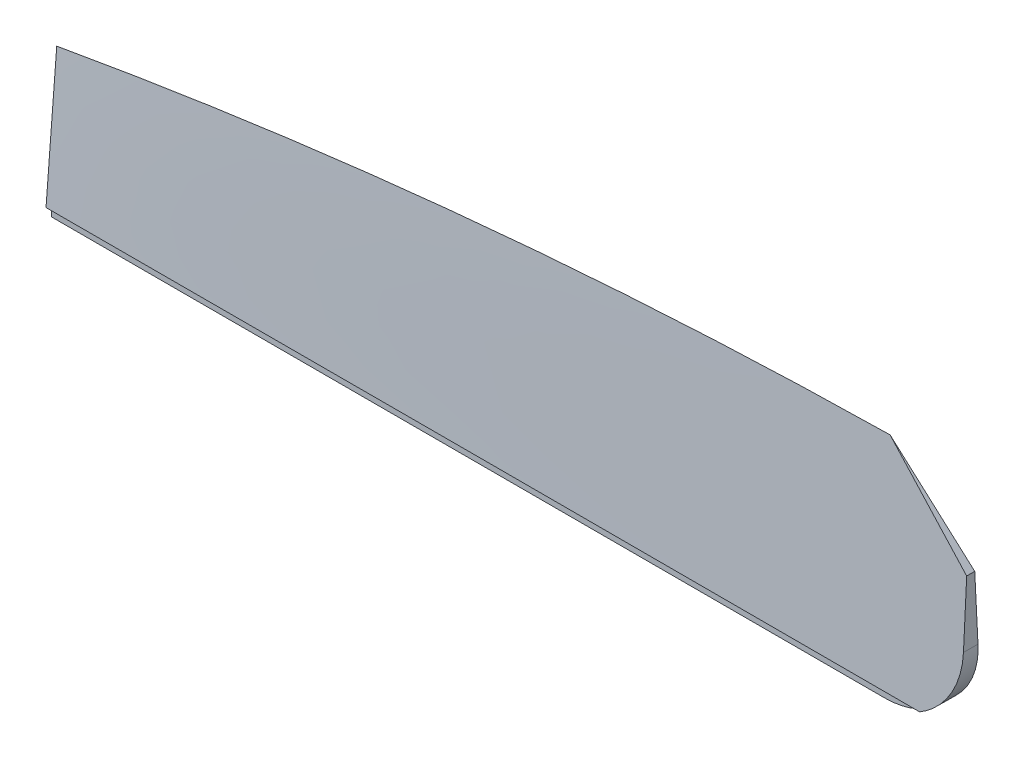
ISO-10303-21;
HEADER;
FILE_DESCRIPTION(('STEP AP214'),'2;1');
FILE_NAME('part.step','',(''),(''),'','','');
FILE_SCHEMA(('AUTOMOTIVE_DESIGN { 1 0 10303 214 1 1 1 1 }'));
ENDSEC;
DATA;
#1=APPLICATION_CONTEXT('core data for automotive mechanical design processes');
#2=APPLICATION_PROTOCOL_DEFINITION('international standard','automotive_design',2000,#1);
#3=PRODUCT_CONTEXT('',#1,'mechanical');
#4=PRODUCT('Part','Part','',(#3));
#5=PRODUCT_RELATED_PRODUCT_CATEGORY('part','',(#4));
#6=PRODUCT_DEFINITION_FORMATION('','',#4);
#7=PRODUCT_DEFINITION_CONTEXT('part definition',#1,'design');
#8=PRODUCT_DEFINITION('design','',#6,#7);
#9=PRODUCT_DEFINITION_SHAPE('','',#8);
#10=(LENGTH_UNIT() NAMED_UNIT(*) SI_UNIT(.MILLI.,.METRE.));
#11=(NAMED_UNIT(*) PLANE_ANGLE_UNIT() SI_UNIT($,.RADIAN.));
#12=(NAMED_UNIT(*) SI_UNIT($,.STERADIAN.) SOLID_ANGLE_UNIT());
#13=UNCERTAINTY_MEASURE_WITH_UNIT(LENGTH_MEASURE(1.E-05),#10,'distance_accuracy_value','');
#14=(GEOMETRIC_REPRESENTATION_CONTEXT(3) GLOBAL_UNCERTAINTY_ASSIGNED_CONTEXT((#13)) GLOBAL_UNIT_ASSIGNED_CONTEXT((#10,
#11,#12)) REPRESENTATION_CONTEXT('',''));
#15=CARTESIAN_POINT('',(0.,0.,0.));
#16=DIRECTION('',(0.,0.,1.));
#17=DIRECTION('',(1.,0.,0.));
#18=AXIS2_PLACEMENT_3D('',#15,#16,#17);
#19=CARTESIAN_POINT('',(-878.284271247463,-49.9999999999999,-10.));
#20=DIRECTION('',(0.,0.,-1.));
#21=DIRECTION('',(0.,1.,0.));
#22=AXIS2_PLACEMENT_3D('',#19,#20,#21);
#23=PLANE('',#22);
#24=CARTESIAN_POINT('',(700.000000000002,80.0000000000001,-10.0000000000001));
#25=DIRECTION('',(0.,0.,-1.));
#26=DIRECTION('',(0.,1.,0.));
#27=AXIS2_PLACEMENT_3D('',#24,#25,#26);
#28=CIRCLE('',#27,150.);
#29=CARTESIAN_POINT('',(700.000000000002,-70.,-10.));
#30=VERTEX_POINT('',#29);
#31=CARTESIAN_POINT('',(774.833147735481,-49.9999999999999,-10.));
#32=VERTEX_POINT('',#31);
#33=EDGE_CURVE('E113',#30,#32,#28,.F.);
#34=ORIENTED_EDGE('',*,*,#33,.F.);
#35=DIRECTION('',(1.,0.,0.));
#36=VECTOR('',#35,1.);
#37=CARTESIAN_POINT('',(-878.284271247463,-69.9999999999999,-10.));
#38=LINE('',#37,#36);
#39=CARTESIAN_POINT('',(-850.000000000001,-69.9999999999999,-10.));
#40=VERTEX_POINT('',#39);
#41=EDGE_CURVE('E150',#40,#30,#38,.T.);
#42=ORIENTED_EDGE('',*,*,#41,.F.);
#43=DIRECTION('',(0.,-1.,0.));
#44=VECTOR('',#43,1.);
#45=CARTESIAN_POINT('',(-850.000000000001,-49.9999999999999,-10.));
#46=LINE('',#45,#44);
#47=CARTESIAN_POINT('',(-850.000000000001,-49.9999999999999,-10.));
#48=VERTEX_POINT('',#47);
#49=EDGE_CURVE('E162',#48,#40,#46,.T.);
#50=ORIENTED_EDGE('',*,*,#49,.F.);
#51=DIRECTION('',(1.,0.,0.));
#52=VECTOR('',#51,1.);
#53=CARTESIAN_POINT('',(-878.284271247463,-49.9999999999999,-10.));
#54=LINE('',#53,#52);
#55=EDGE_CURVE('E152',#48,#32,#54,.T.);
#56=ORIENTED_EDGE('',*,*,#55,.T.);
#57=EDGE_LOOP('',(#34,#42,#50,#56));
#58=FACE_BOUND('',#57,.T.);
#59=ADVANCED_FACE('F100',(#58),#23,.T.);
#60=CARTESIAN_POINT('',(-878.284271247463,-69.9999999999999,9.99999999999996));
#61=DIRECTION('',(0.,-1.,0.));
#62=DIRECTION('',(0.,0.,-1.));
#63=AXIS2_PLACEMENT_3D('',#60,#61,#62);
#64=PLANE('',#63);
#65=DIRECTION('',(0.,0.,1.));
#66=VECTOR('',#65,1.);
#67=CARTESIAN_POINT('',(700.000000000002,-70.,-20.0001));
#68=LINE('',#67,#66);
#69=CARTESIAN_POINT('',(700.000000000002,-70.,9.99999999999996));
#70=VERTEX_POINT('',#69);
#71=EDGE_CURVE('E137',#30,#70,#68,.T.);
#72=ORIENTED_EDGE('',*,*,#71,.T.);
#73=DIRECTION('',(1.,0.,0.));
#74=VECTOR('',#73,1.);
#75=CARTESIAN_POINT('',(-878.284271247463,-69.9999999999999,9.99999999999996));
#76=LINE('',#75,#74);
#77=CARTESIAN_POINT('',(-850.000000000001,-69.9999999999999,9.99999999999996));
#78=VERTEX_POINT('',#77);
#79=EDGE_CURVE('E156',#78,#70,#76,.T.);
#80=ORIENTED_EDGE('',*,*,#79,.F.);
#81=DIRECTION('',(0.,0.,1.));
#82=VECTOR('',#81,1.);
#83=CARTESIAN_POINT('',(-850.000000000001,-69.9999999999999,9.99999999999996));
#84=LINE('',#83,#82);
#85=EDGE_CURVE('E122',#40,#78,#84,.T.);
#86=ORIENTED_EDGE('',*,*,#85,.F.);
#87=ORIENTED_EDGE('',*,*,#41,.T.);
#88=EDGE_LOOP('',(#72,#80,#86,#87));
#89=FACE_BOUND('',#88,.T.);
#90=ADVANCED_FACE('F154',(#89),#64,.T.);
#91=CARTESIAN_POINT('',(-878.284271247463,-49.9999999999999,9.99999999999996));
#92=DIRECTION('',(0.,0.,1.));
#93=DIRECTION('',(0.,-1.,0.));
#94=AXIS2_PLACEMENT_3D('',#91,#92,#93);
#95=PLANE('',#94);
#96=CARTESIAN_POINT('',(700.000000000002,80.0000000000001,9.99999999999994));
#97=DIRECTION('',(0.,0.,1.));
#98=DIRECTION('',(0.,-1.,0.));
#99=AXIS2_PLACEMENT_3D('',#96,#97,#98);
#100=CIRCLE('',#99,150.);
#101=CARTESIAN_POINT('',(774.833147735481,-49.9999999999999,9.99999999999995));
#102=VERTEX_POINT('',#101);
#103=EDGE_CURVE('E140',#102,#70,#100,.F.);
#104=ORIENTED_EDGE('',*,*,#103,.F.);
#105=DIRECTION('',(1.,0.,0.));
#106=VECTOR('',#105,1.);
#107=CARTESIAN_POINT('',(-878.284271247463,-49.9999999999999,9.99999999999996));
#108=LINE('',#107,#106);
#109=CARTESIAN_POINT('',(-850.000000000001,-49.9999999999999,9.99999999999996));
#110=VERTEX_POINT('',#109);
#111=EDGE_CURVE('E159',#110,#102,#108,.T.);
#112=ORIENTED_EDGE('',*,*,#111,.F.);
#113=DIRECTION('',(0.,1.,0.));
#114=VECTOR('',#113,1.);
#115=CARTESIAN_POINT('',(-850.000000000001,-49.9999999999999,9.99999999999996));
#116=LINE('',#115,#114);
#117=EDGE_CURVE('E155',#78,#110,#116,.T.);
#118=ORIENTED_EDGE('',*,*,#117,.F.);
#119=ORIENTED_EDGE('',*,*,#79,.T.);
#120=EDGE_LOOP('',(#104,#112,#118,#119));
#121=FACE_BOUND('',#120,.T.);
#122=ADVANCED_FACE('F174',(#121),#95,.T.);
#123=CARTESIAN_POINT('',(-878.284271247463,-49.9999999999999,9.99999999999996));
#124=DIRECTION('',(0.,1.,0.));
#125=DIRECTION('',(0.,0.,1.));
#126=AXIS2_PLACEMENT_3D('',#123,#124,#125);
#127=PLANE('',#126);
#128=DIRECTION('',(0.,0.,1.));
#129=VECTOR('',#128,1.);
#130=CARTESIAN_POINT('',(774.833147735481,-49.9999999999999,-20.0001));
#131=LINE('',#130,#129);
#132=EDGE_CURVE('E14',#32,#102,#131,.T.);
#133=ORIENTED_EDGE('',*,*,#132,.F.);
#134=ORIENTED_EDGE('',*,*,#55,.F.);
#135=DIRECTION('',(0.,0.,-1.));
#136=VECTOR('',#135,1.);
#137=CARTESIAN_POINT('',(-850.000000000001,-49.9999999999999,9.99999999999996));
#138=LINE('',#137,#136);
#139=EDGE_CURVE('E107',#110,#48,#138,.T.);
#140=ORIENTED_EDGE('',*,*,#139,.F.);
#141=ORIENTED_EDGE('',*,*,#111,.T.);
#142=EDGE_LOOP('',(#133,#134,#140,#141));
#143=FACE_BOUND('',#142,.T.);
#144=ADVANCED_FACE('F171',(#143),#127,.T.);
#145=CARTESIAN_POINT('',(-850.000000000001,0.,0.));
#146=DIRECTION('',(1.,0.,0.));
#147=DIRECTION('',(0.,0.,-1.));
#148=AXIS2_PLACEMENT_3D('',#145,#146,#147);
#149=PLANE('',#148);
#150=ORIENTED_EDGE('',*,*,#49,.T.);
#151=ORIENTED_EDGE('',*,*,#85,.T.);
#152=ORIENTED_EDGE('',*,*,#117,.T.);
#153=ORIENTED_EDGE('',*,*,#139,.T.);
#154=EDGE_LOOP('',(#150,#151,#152,#153));
#155=FACE_BOUND('',#154,.T.);
#156=ADVANCED_FACE('F169',(#155),#149,.F.);
#157=CARTESIAN_POINT('',(700.000000000002,80.0000000000001,-20.0001));
#158=DIRECTION('',(0.,0.,1.));
#159=DIRECTION('',(1.,0.,0.));
#160=AXIS2_PLACEMENT_3D('',#157,#158,#159);
#161=CYLINDRICAL_SURFACE('',#160,150.);
#162=ORIENTED_EDGE('',*,*,#33,.T.);
#163=ORIENTED_EDGE('',*,*,#132,.T.);
#164=ORIENTED_EDGE('',*,*,#103,.T.);
#165=ORIENTED_EDGE('',*,*,#71,.F.);
#166=EDGE_LOOP('',(#162,#163,#164,#165));
#167=FACE_BOUND('',#166,.T.);
#168=ADVANCED_FACE('F138',(#167),#161,.T.);
#169=CLOSED_SHELL('',(#59,#90,#122,#144,#156,#168));
#170=MANIFOLD_SOLID_BREP('B2',#169);
#171=CARTESIAN_POINT('',(850.000000000002,0.,0.));
#172=DIRECTION('',(1.,0.,0.));
#173=DIRECTION('',(0.,0.,-1.));
#174=AXIS2_PLACEMENT_3D('',#171,#172,#173);
#175=PLANE('',#174);
#176=DIRECTION('',(0.,-0.998752338877845,0.0499376169438921));
#177=VECTOR('',#176,1.);
#178=CARTESIAN_POINT('',(850.000000000002,-49.9999999999999,20.));
#179=LINE('',#178,#177);
#180=CARTESIAN_POINT('',(850.000000000001,200.187149168324,7.49064254158379));
#181=VERTEX_POINT('',#180);
#182=CARTESIAN_POINT('',(850.000000000002,80.0000000000001,13.5));
#183=VERTEX_POINT('',#182);
#184=EDGE_CURVE('E227',#181,#183,#179,.T.);
#185=ORIENTED_EDGE('',*,*,#184,.T.);
#186=DIRECTION('',(0.,0.,1.));
#187=VECTOR('',#186,1.);
#188=CARTESIAN_POINT('',(850.000000000002,80.0000000000001,-20.0001));
#189=LINE('',#188,#187);
#190=CARTESIAN_POINT('',(850.000000000002,80.0000000000001,-13.5));
#191=VERTEX_POINT('',#190);
#192=EDGE_CURVE('E281',#191,#183,#189,.T.);
#193=ORIENTED_EDGE('',*,*,#192,.F.);
#194=DIRECTION('',(0.,0.998752338877845,0.0499376169438923));
#195=VECTOR('',#194,1.);
#196=CARTESIAN_POINT('',(850.000000000002,350.,0.));
#197=LINE('',#196,#195);
#198=CARTESIAN_POINT('',(850.000000000002,200.187149168324,-7.49064254158384));
#199=VERTEX_POINT('',#198);
#200=EDGE_CURVE('E248',#191,#199,#197,.T.);
#201=ORIENTED_EDGE('',*,*,#200,.T.);
#202=DIRECTION('',(0.,0.,1.));
#203=VECTOR('',#202,1.);
#204=CARTESIAN_POINT('',(850.000000000002,200.187149168324,0.));
#205=LINE('',#204,#203);
#206=EDGE_CURVE('E373',#199,#181,#205,.T.);
#207=ORIENTED_EDGE('',*,*,#206,.T.);
#208=EDGE_LOOP('',(#185,#193,#201,#207));
#209=FACE_BOUND('',#208,.T.);
#210=ADVANCED_FACE('F223',(#209),#175,.T.);
#211=CARTESIAN_POINT('',(850.000000000002,350.,0.));
#212=CARTESIAN_POINT('',(280.00816518473,350.,0.));
#213=CARTESIAN_POINT('',(-288.814905980155,299.809729014863,0.));
#214=CARTESIAN_POINT('',(-850.000000000001,200.,0.));
#215=CARTESIAN_POINT('',(850.000000000002,316.666666666667,-1.66666666666667));
#216=CARTESIAN_POINT('',(280.00816518473,320.833333333333,-1.66666666666667));
#217=CARTESIAN_POINT('',(-288.814905980155,274.809729014863,-1.66666666666667));
#218=CARTESIAN_POINT('',(-850.000000000001,179.166666666666,-1.66666666666667));
#219=CARTESIAN_POINT('',(850.000000000002,250.,-5.));
#220=CARTESIAN_POINT('',(280.374876172218,256.985827917574,-5.));
#221=CARTESIAN_POINT('',(-288.210379283017,219.316540671524,-5.));
#222=CARTESIAN_POINT('',(-850.000000000002,137.5,-5.));
#223=CARTESIAN_POINT('',(850.000000000002,150.,-10.));
#224=CARTESIAN_POINT('',(281.508403135182,152.441171642956,-10.));
#225=CARTESIAN_POINT('',(-286.34174885083,127.336746467719,-10.));
#226=CARTESIAN_POINT('',(-850.000000000002,75.0000000000001,-10.));
#227=CARTESIAN_POINT('',(850.000000000002,50.0000000000001,-15.));
#228=CARTESIAN_POINT('',(282.708718099148,46.892235313654,-15.));
#229=CARTESIAN_POINT('',(-284.363017737093,34.3564939163386,-15.));
#230=CARTESIAN_POINT('',(-850.000000000002,12.4999999999999,-15.));
#231=CARTESIAN_POINT('',(850.000000000002,-16.6666666666665,-18.3333333333334));
#232=CARTESIAN_POINT('',(283.209005088639,-18.963830211471,-18.3333333333334));
#233=CARTESIAN_POINT('',(-283.538289676856,-23.1376111221519,-18.3333333333334));
#234=CARTESIAN_POINT('',(-850.000000000001,-29.1666666666666,-18.3333333333334));
#235=CARTESIAN_POINT('',(850.000000000002,-49.9999999999999,-20.));
#236=CARTESIAN_POINT('',(283.298055756641,-49.4695369510483,-20.));
#237=CARTESIAN_POINT('',(-283.391488768123,-49.4715555855864,-20.));
#238=CARTESIAN_POINT('',(-850.000000000001,-49.9999999999999,-20.));
#239=B_SPLINE_SURFACE_WITH_KNOTS('',3,3,((#211,#212,#213,#214),(#215,#216,#217,#218),(#219,#220,
#221,#222),(#223,#224,#225,#226),(#227,#228,#229,#230),(#231,#232,#233,#234),(#235,#236,#237,
#238)),.UNSPECIFIED.,.F.,.F.,.F.,(4,1,1,1,4),(4,4),(0.,0.117411371706765,0.234822743413531,
0.352234115120296,0.469645486827062),(0.,1.),.UNSPECIFIED.);
#240=CARTESIAN_POINT('',(774.949660102837,-49.932861318719,-20.));
#241=CARTESIAN_POINT('',(776.77858711772,-48.8779075175034,-19.9465608704581));
#242=CARTESIAN_POINT('',(778.585167772061,-47.784315123692,-19.8912312247742));
#243=CARTESIAN_POINT('',(782.150398667031,-45.5219771033586,-19.7769006549077));
#244=CARTESIAN_POINT('',(783.909051282835,-44.3532352107069,-19.7178999131315));
#245=CARTESIAN_POINT('',(787.375321059771,-41.9426514605261,-19.596333316115));
#246=CARTESIAN_POINT('',(789.082939679335,-40.700811694982,-19.5337675629031));
#247=CARTESIAN_POINT('',(792.444146996505,-38.1462456513558,-19.4051819741731));
#248=CARTESIAN_POINT('',(794.097736161442,-36.8335199866671,-19.3391621685438));
#249=CARTESIAN_POINT('',(797.344943290174,-34.1420209252222,-19.2039092877608));
#250=CARTESIAN_POINT('',(798.938666816147,-32.7633745715606,-19.1346824007601));
#251=CARTESIAN_POINT('',(802.066537267821,-29.9402579340014,-18.9930217124556));
#252=CARTESIAN_POINT('',(803.60068463029,-28.4957881328392,-18.9205879346707));
#253=CARTESIAN_POINT('',(806.606694746188,-25.543595289172,-18.7726362925268));
#254=CARTESIAN_POINT('',(808.078557745969,-24.0358724968968,-18.6971184403685));
#255=CARTESIAN_POINT('',(810.95740122845,-20.9598559370413,-18.5431254986109));
#256=CARTESIAN_POINT('',(812.364381803895,-19.3915622560478,-18.4646504132389));
#257=CARTESIAN_POINT('',(815.112035929349,-16.1959613181554,-18.3048123472268));
#258=CARTESIAN_POINT('',(816.452657508962,-14.5686094846967,-18.2234471862111));
#259=CARTESIAN_POINT('',(819.064073766274,-11.2589161659202,-18.0580208447582));
#260=CARTESIAN_POINT('',(820.334867667326,-9.57657406931391,-17.973959634351));
#261=CARTESIAN_POINT('',(822.804365575482,-6.15991405452798,-17.8032818725874));
#262=CARTESIAN_POINT('',(824.003069625522,-4.42559616730517,-17.716665322753));
#263=CARTESIAN_POINT('',(826.326255849931,-0.908093100816467,-17.5410220620969));
#264=CARTESIAN_POINT('',(827.450738995349,0.875091438684212,-17.4519953828289));
#265=CARTESIAN_POINT('',(829.62378046871,4.48761861289257,-17.2716572170923));
#266=CARTESIAN_POINT('',(830.67232019397,6.31697240998206,-17.1803451781355));
#267=CARTESIAN_POINT('',(832.691324376901,10.018172046465,-16.9956098419942));
#268=CARTESIAN_POINT('',(833.661788632527,11.8900179958048,-16.9021865393469));
#269=CARTESIAN_POINT('',(835.522948971886,15.6729137761091,-16.713384068965));
#270=CARTESIAN_POINT('',(836.413642979662,17.5839646257596,-16.6180048504087));
#271=CARTESIAN_POINT('',(838.113712329987,21.4419423349024,-16.4254488910616));
#272=CARTESIAN_POINT('',(838.923083680132,23.3888709502075,-16.3282720622971));
#273=CARTESIAN_POINT('',(840.369419920893,27.0859819693399,-16.1437259596028));
#274=CARTESIAN_POINT('',(841.015482668996,28.8326215876761,-16.0565349881066));
#275=CARTESIAN_POINT('',(842.242164774215,32.3488317474733,-15.8809944100838));
#276=CARTESIAN_POINT('',(842.82277936083,34.1184039500161,-15.7926447196218));
#277=CARTESIAN_POINT('',(843.917737735173,37.6779915004003,-15.6149081231438));
#278=CARTESIAN_POINT('',(844.432077677113,39.4680080280305,-15.5255211572645));
#279=CARTESIAN_POINT('',(845.393763653481,43.0659884799455,-15.34583277157));
#280=CARTESIAN_POINT('',(845.841106718159,44.8739531960285,-15.2555313114076));
#281=CARTESIAN_POINT('',(846.668168809293,48.5053013080179,-15.0741393011174));
#282=CARTESIAN_POINT('',(847.047885826248,50.3286851604162,-14.9830487276255));
#283=CARTESIAN_POINT('',(847.740060930784,53.9930742923785,-14.7999684114481));
#284=CARTESIAN_POINT('',(848.05234079421,55.8341131535203,-14.7079769418882));
#285=CARTESIAN_POINT('',(848.607947657228,59.5265179444817,-14.5234600740348));
#286=CARTESIAN_POINT('',(848.851275437625,61.3778837571181,-14.4309346817995));
#287=CARTESIAN_POINT('',(849.268646073513,65.0883661063537,-14.2454804667443));
#288=CARTESIAN_POINT('',(849.442689763692,66.9474825493058,-14.1525516487984));
#289=CARTESIAN_POINT('',(849.721249133602,70.6708807030245,-13.9664222847249));
#290=CARTESIAN_POINT('',(849.825765650698,72.5351623513114,-13.8732217418837));
#291=CARTESIAN_POINT('',(849.96514925297,76.2662957154767,-13.6866819652459));
#292=CARTESIAN_POINT('',(850.000017257257,78.1331473971146,-13.5933427332959));
#293=CARTESIAN_POINT('',(850.000000000002,80.0000000000001,-13.5));
#294=B_SPLINE_CURVE_WITH_KNOTS('',3,(#240,#241,#242,#243,#244,#245,#246,#247,#248,#249,#250,
#251,#252,#253,#254,#255,#256,#257,#258,#259,#260,#261,#262,#263,#264,#265,#266,#267,#268,#269,
#270,#271,#272,#273,#274,#275,#276,#277,#278,#279,#280,#281,#282,#283,#284,#285,#286,#287,#288,
#289,#290,#291,#292,#293),.UNSPECIFIED.,.F.,.F.,(4,2,2,2,2,2,2,2,2,2,2,2,2,2,2,2,2,2,2,2,2,2,2,
2,2,2,4),(0.,6.33567583159722,12.6710371123376,19.0062171697201,25.3413424159976,
31.6647153412315,37.9880418996153,44.3113434451808,50.6346359518538,56.9628047618149,
63.2910439415621,69.6192793522742,75.9474319528824,82.277129456963,88.606843340677,
94.9367219022408,101.266911067176,106.858660550991,112.450817352722,118.043298510357,
123.636027490807,129.228922630774,134.83642263234,140.443859132737,146.051228076464,
151.658529485517,157.265756897738),.UNSPECIFIED.);
#295=CARTESIAN_POINT('',(774.949660102837,-49.9328613187191,-20.));
#296=VERTEX_POINT('',#295);
#297=EDGE_CURVE('E279',#296,#191,#294,.T.);
#298=CARTESIAN_POINT('',(850.000000000002,-49.9999999999999,-20.));
#299=CARTESIAN_POINT('',(283.298055756641,-49.4695369510483,-20.));
#300=CARTESIAN_POINT('',(-283.391488768123,-49.4715555855864,-20.));
#301=CARTESIAN_POINT('',(-850.000000000001,-49.9999999999999,-20.));
#302=B_SPLINE_CURVE_WITH_KNOTS('',3,(#298,#299,#300,#301),.UNSPECIFIED.,.F.,.F.,(4,4),(0.,1.),.UNSPECIFIED.);
#303=CARTESIAN_POINT('',(-850.000000000001,-49.9999999999999,-20.));
#304=VERTEX_POINT('',#303);
#305=EDGE_CURVE('E293',#296,#304,#302,.T.);
#306=DIRECTION('',(0.,0.996815278536125,0.0797452222828903));
#307=VECTOR('',#306,1.);
#308=CARTESIAN_POINT('',(-850.000000000001,-49.9999999999999,-20.));
#309=LINE('',#308,#307);
#310=CARTESIAN_POINT('',(-850.000000000001,200.,0.));
#311=VERTEX_POINT('',#310);
#312=EDGE_CURVE('E453',#304,#311,#309,.T.);
#313=CARTESIAN_POINT('',(850.000000000002,350.,0.));
#314=CARTESIAN_POINT('',(280.00816518473,350.,0.));
#315=CARTESIAN_POINT('',(-288.814905980155,299.809729014863,0.));
#316=CARTESIAN_POINT('',(-850.000000000001,200.,0.));
#317=B_SPLINE_CURVE_WITH_KNOTS('',3,(#313,#314,#315,#316),.UNSPECIFIED.,.F.,.F.,(4,4),(0.,1.),.UNSPECIFIED.);
#318=CARTESIAN_POINT('',(700.00572793551,348.841362798852,0.));
#319=VERTEX_POINT('',#318);
#320=EDGE_CURVE('E456',#319,#311,#317,.T.);
#321=CARTESIAN_POINT('',(700.00572792613,348.84136280184,0.));
#322=CARTESIAN_POINT('',(706.255156847357,342.647766679143,-0.325175200797074));
#323=CARTESIAN_POINT('',(712.504662229815,336.454094778324,-0.647419087850865));
#324=CARTESIAN_POINT('',(725.003793911147,324.066631140545,-1.28714331297075));
#325=CARTESIAN_POINT('',(731.253420209978,317.872839403627,-1.60462365267408));
#326=CARTESIAN_POINT('',(743.752765449417,305.485164115684,-2.23592005509614));
#327=CARTESIAN_POINT('',(750.002484390017,299.291280564666,-2.5497361181459));
#328=CARTESIAN_POINT('',(762.50199181415,286.903444540995,-3.17461383455576));
#329=CARTESIAN_POINT('',(768.751780297686,280.709492068342,-3.48567548786212));
#330=CARTESIAN_POINT('',(781.251405051187,268.321539763532,-4.10584843071519));
#331=CARTESIAN_POINT('',(787.501241321146,262.127539931383,-4.41495972056983));
#332=CARTESIAN_POINT('',(800.000945721144,249.739508691643,-5.03192784566326));
#333=CARTESIAN_POINT('',(806.250813851187,243.54547728405,-5.33978468077303));
#334=CARTESIAN_POINT('',(818.750566840486,231.157397889109,-5.95485337931901));
#335=CARTESIAN_POINT('',(825.000451699744,224.963349901761,-6.26206524268009));
#336=CARTESIAN_POINT('',(837.500225814535,212.575249570065,-6.87634081366392));
#337=CARTESIAN_POINT('',(843.750115070068,206.381197225717,-7.18340452126958));
#338=CARTESIAN_POINT('',(850.000000000002,200.187149168324,-7.49064254158384));
#339=B_SPLINE_CURVE_WITH_KNOTS('',3,(#321,#322,#323,#324,#325,#326,#327,#328,#329,#330,#331,
#332,#333,#334,#335,#336,#337,#338),.UNSPECIFIED.,.F.,.F.,(4,2,2,2,2,2,2,2,4),(0.,
26.4139267368752,52.827844395116,79.2417596672516,105.655675454729,132.06958707179,
158.483501405708,184.897418816949,211.311339276757),.UNSPECIFIED.);
#340=EDGE_CURVE('E233',#319,#199,#339,.T.);
#341=ORIENTED_EDGE('',*,*,#297,.F.);
#342=ORIENTED_EDGE('',*,*,#305,.T.);
#343=ORIENTED_EDGE('',*,*,#312,.T.);
#344=ORIENTED_EDGE('',*,*,#320,.F.);
#345=ORIENTED_EDGE('',*,*,#340,.T.);
#346=ORIENTED_EDGE('',*,*,#200,.F.);
#347=EDGE_LOOP('',(#341,#342,#343,#344,#345,#346));
#348=FACE_BOUND('',#347,.T.);
#349=ADVANCED_FACE('F291',(#348),#239,.T.);
#350=CARTESIAN_POINT('',(850.000000000002,-49.9999999999999,20.));
#351=CARTESIAN_POINT('',(283.298055756641,-49.4695369510484,20.));
#352=CARTESIAN_POINT('',(-283.391488768125,-49.4715555855864,20.));
#353=CARTESIAN_POINT('',(-850.000000000001,-49.9999999999999,20.));
#354=CARTESIAN_POINT('',(850.000000000002,-16.6666666666666,18.3333333333333));
#355=CARTESIAN_POINT('',(283.209005088638,-18.963830211471,18.3333333333333));
#356=CARTESIAN_POINT('',(-283.538289676859,-23.1376111221519,18.3333333333333));
#357=CARTESIAN_POINT('',(-850.000000000001,-29.1666666666666,18.3333333333333));
#358=CARTESIAN_POINT('',(850.000000000002,50.0000000000002,15.));
#359=CARTESIAN_POINT('',(282.708718099147,46.8922353136541,15.));
#360=CARTESIAN_POINT('',(-284.363017737096,34.3564939163387,15.));
#361=CARTESIAN_POINT('',(-850.000000000002,12.5,15.));
#362=CARTESIAN_POINT('',(850.000000000001,150.,9.99999999999998));
#363=CARTESIAN_POINT('',(281.508403135181,152.441171642955,9.99999999999998));
#364=CARTESIAN_POINT('',(-286.341748850832,127.336746467719,9.99999999999999));
#365=CARTESIAN_POINT('',(-850.000000000001,74.9999999999998,9.99999999999999));
#366=CARTESIAN_POINT('',(850.000000000002,250.,4.99999999999999));
#367=CARTESIAN_POINT('',(280.374876172218,256.985827917574,4.99999999999999));
#368=CARTESIAN_POINT('',(-288.210379283018,219.316540671524,4.99999999999999));
#369=CARTESIAN_POINT('',(-850.000000000002,137.5,4.99999999999999));
#370=CARTESIAN_POINT('',(850.000000000002,316.666666666667,1.66666666666667));
#371=CARTESIAN_POINT('',(280.00816518473,320.833333333333,1.66666666666666));
#372=CARTESIAN_POINT('',(-288.814905980155,274.809729014863,1.66666666666666));
#373=CARTESIAN_POINT('',(-850.000000000001,179.166666666666,1.66666666666666));
#374=CARTESIAN_POINT('',(850.000000000002,350.,0.));
#375=CARTESIAN_POINT('',(280.00816518473,350.,0.));
#376=CARTESIAN_POINT('',(-288.814905980155,299.809729014863,0.));
#377=CARTESIAN_POINT('',(-850.000000000001,200.,0.));
#378=B_SPLINE_SURFACE_WITH_KNOTS('',3,3,((#350,#351,#352,#353),(#354,#355,#356,#357),(#358,#359,
#360,#361),(#362,#363,#364,#365),(#366,#367,#368,#369),(#370,#371,#372,#373),(#374,#375,#376,
#377)),.UNSPECIFIED.,.F.,.F.,.F.,(4,1,1,1,4),(4,4),(0.530354513172938,0.647765884879704,
0.765177256586469,0.882588628293234,1.),(0.,1.),.UNSPECIFIED.);
#379=CARTESIAN_POINT('',(850.000000000002,80.0000000000001,13.5));
#380=CARTESIAN_POINT('',(850.000028294553,77.8875240860568,13.6056239693196));
#381=CARTESIAN_POINT('',(849.955375513624,75.7750499411482,13.7112433464042));
#382=CARTESIAN_POINT('',(849.776914555197,71.5539481109475,13.9222761779022));
#383=CARTESIAN_POINT('',(849.643110067241,69.4453202700973,14.0276896406565));
#384=CARTESIAN_POINT('',(849.28655676718,65.2356298615337,14.2381201121283));
#385=CARTESIAN_POINT('',(849.063810125119,63.1345671105063,14.3431371304555));
#386=CARTESIAN_POINT('',(848.529776821034,58.9437107694889,14.5525863689352));
#387=CARTESIAN_POINT('',(848.218490824984,56.8539170948559,14.6570185934805));
#388=CARTESIAN_POINT('',(847.508543845687,52.6929266289923,14.8649301085629));
#389=CARTESIAN_POINT('',(847.110035756727,50.6217038165694,14.9684107404887));
#390=CARTESIAN_POINT('',(846.226038786653,46.4978749738802,15.1744176631875));
#391=CARTESIAN_POINT('',(845.740550681597,44.4452687776837,15.2769439624668));
#392=CARTESIAN_POINT('',(844.683449181768,40.3623093743229,15.4808615757106));
#393=CARTESIAN_POINT('',(844.111836237263,38.3319560508785,15.582252895606));
#394=CARTESIAN_POINT('',(842.883491374828,34.2970995291742,15.7837234325241));
#395=CARTESIAN_POINT('',(842.226759556948,32.2925963005329,15.8838026510889));
#396=CARTESIAN_POINT('',(840.828762301952,28.3113698341129,16.0825566512455));
#397=CARTESIAN_POINT('',(840.087428131496,26.3346706706618,16.1812302165863));
#398=CARTESIAN_POINT('',(838.52196093471,22.4142245071458,16.3769201670363));
#399=CARTESIAN_POINT('',(837.697826913562,20.470477903325,16.4739365322184));
#400=CARTESIAN_POINT('',(835.968224473986,16.6194235776768,16.6661448551318));
#401=CARTESIAN_POINT('',(835.062756085501,14.7121158424339,16.7613368135347));
#402=CARTESIAN_POINT('',(833.172097415959,10.9373599045755,16.9497335577949));
#403=CARTESIAN_POINT('',(832.186908102428,9.06991121856111,17.0429383677518));
#404=CARTESIAN_POINT('',(830.138360105263,5.37785190441184,17.2272210555598));
#405=CARTESIAN_POINT('',(829.074987609935,3.55324892079682,17.3182985538413));
#406=CARTESIAN_POINT('',(826.872106206044,-0.0495273658644838,17.4981569398976));
#407=CARTESIAN_POINT('',(825.732597086174,-1.82770054003163,17.5869378212976));
#408=CARTESIAN_POINT('',(823.379439291447,-5.33447619801483,17.7620561585063));
#409=CARTESIAN_POINT('',(822.165788792353,-7.06307746058269,17.8483935541169));
#410=CARTESIAN_POINT('',(819.666451583191,-10.467673438931,18.0184834155779));
#411=CARTESIAN_POINT('',(818.380761456188,-12.1436656535016,18.1022357585232));
#412=CARTESIAN_POINT('',(815.898915368993,-15.2412264211618,18.257077010133));
#413=CARTESIAN_POINT('',(814.710649078568,-16.6691104161418,18.3284754164002));
#414=CARTESIAN_POINT('',(812.281756627865,-19.4799343218317,18.4690742537826));
#415=CARTESIAN_POINT('',(811.041126785971,-20.862871060216,18.5382745297485));
#416=CARTESIAN_POINT('',(808.509231021317,-23.5818412380281,18.6743849876704));
#417=CARTESIAN_POINT('',(807.217962332774,-24.9178721079859,18.7412950441648));
#418=CARTESIAN_POINT('',(804.586571363913,-27.5411580732277,18.8727365375751));
#419=CARTESIAN_POINT('',(803.246447084471,-28.8284111681661,18.9372678769385));
#420=CARTESIAN_POINT('',(800.519202554199,-31.352332829494,19.0638656874383));
#421=CARTESIAN_POINT('',(799.132081028915,-32.5890000221026,19.1259320916321));
#422=CARTESIAN_POINT('',(796.308980189675,-35.0132662559645,19.2476796880181));
#423=CARTESIAN_POINT('',(794.872879112607,-36.2007238528855,19.3073539903567));
#424=CARTESIAN_POINT('',(791.957384238778,-38.5213515812467,19.4240579959452));
#425=CARTESIAN_POINT('',(790.477990873071,-39.6545222529157,19.4810877255119));
#426=CARTESIAN_POINT('',(787.477959312595,-41.8650003400591,19.5924243632097));
#427=CARTESIAN_POINT('',(785.957321431257,-42.9423081798703,19.6467312920232));
#428=CARTESIAN_POINT('',(782.876900805482,-45.039556886434,19.7525463846362));
#429=CARTESIAN_POINT('',(781.317118209739,-46.0594979710488,19.8040545590646));
#430=CARTESIAN_POINT('',(778.160577452301,-48.0406094405343,19.9041992691999));
#431=CARTESIAN_POINT('',(776.563819307397,-49.0017798520932,19.9528358062109));
#432=CARTESIAN_POINT('',(774.949660102837,-49.932861318719,20.));
#433=B_SPLINE_CURVE_WITH_KNOTS('',3,(#379,#380,#381,#382,#383,#384,#385,#386,#387,#388,#389,
#390,#391,#392,#393,#394,#395,#396,#397,#398,#399,#400,#401,#402,#403,#404,#405,#406,#407,#408,
#409,#410,#411,#412,#413,#414,#415,#416,#417,#418,#419,#420,#421,#422,#423,#424,#425,#426,#427,
#428,#429,#430,#431,#432),.UNSPECIFIED.,.F.,.F.,(4,2,2,2,2,2,2,2,2,2,2,2,2,2,2,2,2,2,2,2,2,2,2,
2,2,2,4),(0.,6.34487050467564,12.6894784433377,19.0339315933585,25.3783370230856,
31.7117089712148,38.0450244143685,44.3783067476617,50.7115816368342,57.0500389869225,
63.3885725009635,69.7271036813394,76.0655579461248,82.4051346532913,88.7447289558841,
95.0844793060907,101.424530614089,107.0003181959,112.576498459539,118.152983707245,
123.729697396117,129.306562433548,134.898479506232,140.490340920167,146.082159851824,
151.673957545944,157.265752700777),.UNSPECIFIED.);
#434=CARTESIAN_POINT('',(774.949660102837,-49.9328613187191,20.));
#435=VERTEX_POINT('',#434);
#436=EDGE_CURVE('E240',#183,#435,#433,.T.);
#437=CARTESIAN_POINT('',(850.000000000001,200.187149168324,7.49064254158379));
#438=CARTESIAN_POINT('',(843.750115070068,206.381197225717,7.18340452126952));
#439=CARTESIAN_POINT('',(837.500225814534,212.575249570065,6.87634081366387));
#440=CARTESIAN_POINT('',(825.000451699743,224.963349901761,6.26206524268005));
#441=CARTESIAN_POINT('',(818.750566840485,231.15739788911,5.95485337931898));
#442=CARTESIAN_POINT('',(806.250813851186,243.54547728405,5.339784680773));
#443=CARTESIAN_POINT('',(800.000945721144,249.739508691644,5.03192784566324));
#444=CARTESIAN_POINT('',(787.501241321145,262.127539931383,4.41495972056981));
#445=CARTESIAN_POINT('',(781.251405051187,268.321539763532,4.10584843071518));
#446=CARTESIAN_POINT('',(768.751780297686,280.709492068342,3.48567548786211));
#447=CARTESIAN_POINT('',(762.50199181415,286.903444540996,3.17461383455574));
#448=CARTESIAN_POINT('',(750.002484390016,299.291280564666,2.54973611814589));
#449=CARTESIAN_POINT('',(743.752765449417,305.485164115684,2.23592005509614));
#450=CARTESIAN_POINT('',(731.253420209978,317.872839403628,1.60462365267408));
#451=CARTESIAN_POINT('',(725.003793911147,324.066631140545,1.28714331297075));
#452=CARTESIAN_POINT('',(712.504662229815,336.454094778324,0.647419087850856));
#453=CARTESIAN_POINT('',(706.255156847357,342.647766679143,0.325175200797064));
#454=CARTESIAN_POINT('',(700.00572792613,348.84136280184,0.));
#455=B_SPLINE_CURVE_WITH_KNOTS('',3,(#437,#438,#439,#440,#441,#442,#443,#444,#445,#446,#447,
#448,#449,#450,#451,#452,#453,#454),.UNSPECIFIED.,.F.,.F.,(4,2,2,2,2,2,2,2,4),(0.,
26.413920459808,52.8278378710488,79.2417522049666,105.655663822027,132.069579609505,
158.483494881641,184.897412539881,211.311339276757),.UNSPECIFIED.);
#456=EDGE_CURVE('E463',#181,#319,#455,.T.);
#457=DIRECTION('',(0.,-0.996815278536125,0.07974522228289));
#458=VECTOR('',#457,1.);
#459=CARTESIAN_POINT('',(-850.000000000001,200.,0.));
#460=LINE('',#459,#458);
#461=CARTESIAN_POINT('',(-850.000000000001,-49.9999999999999,20.));
#462=VERTEX_POINT('',#461);
#463=EDGE_CURVE('E414',#311,#462,#460,.T.);
#464=CARTESIAN_POINT('',(850.000000000002,-49.9999999999999,20.));
#465=CARTESIAN_POINT('',(283.298055756641,-49.4695369510484,20.));
#466=CARTESIAN_POINT('',(-283.391488768125,-49.4715555855864,20.));
#467=CARTESIAN_POINT('',(-850.000000000001,-49.9999999999999,20.));
#468=B_SPLINE_CURVE_WITH_KNOTS('',3,(#464,#465,#466,#467),.UNSPECIFIED.,.F.,.F.,(4,4),(0.,1.),.UNSPECIFIED.);
#469=EDGE_CURVE('E457',#435,#462,#468,.T.);
#470=ORIENTED_EDGE('',*,*,#436,.F.);
#471=ORIENTED_EDGE('',*,*,#184,.F.);
#472=ORIENTED_EDGE('',*,*,#456,.T.);
#473=ORIENTED_EDGE('',*,*,#320,.T.);
#474=ORIENTED_EDGE('',*,*,#463,.T.);
#475=ORIENTED_EDGE('',*,*,#469,.F.);
#476=EDGE_LOOP('',(#470,#471,#472,#473,#474,#475));
#477=FACE_BOUND('',#476,.T.);
#478=ADVANCED_FACE('F319',(#477),#378,.T.);
#479=CARTESIAN_POINT('',(-850.000000000001,0.,0.));
#480=DIRECTION('',(-1.,0.,0.));
#481=DIRECTION('',(0.,0.,1.));
#482=AXIS2_PLACEMENT_3D('',#479,#480,#481);
#483=PLANE('',#482);
#484=ORIENTED_EDGE('',*,*,#312,.F.);
#485=DIRECTION('',(0.,0.,-1.));
#486=VECTOR('',#485,1.);
#487=CARTESIAN_POINT('',(-850.000000000001,-49.9999999999999,20.));
#488=LINE('',#487,#486);
#489=CARTESIAN_POINT('',(-850.000000000001,-49.9999999999999,-10.0000000000001));
#490=VERTEX_POINT('',#489);
#491=EDGE_CURVE('E368',#490,#304,#488,.T.);
#492=ORIENTED_EDGE('',*,*,#491,.F.);
#493=CARTESIAN_POINT('',(-850.000000000002,-49.9999999999999,10.));
#494=VERTEX_POINT('',#493);
#495=EDGE_CURVE('E436',#494,#490,#488,.T.);
#496=ORIENTED_EDGE('',*,*,#495,.F.);
#497=EDGE_CURVE('E567',#462,#494,#488,.T.);
#498=ORIENTED_EDGE('',*,*,#497,.F.);
#499=ORIENTED_EDGE('',*,*,#463,.F.);
#500=EDGE_LOOP('',(#484,#492,#496,#498,#499));
#501=FACE_BOUND('',#500,.T.);
#502=ADVANCED_FACE('F392',(#501),#483,.T.);
#503=CARTESIAN_POINT('',(850.000000000002,-49.9999999999999,-20.));
#504=CARTESIAN_POINT('',(283.298055756641,-49.4695369510483,-20.));
#505=CARTESIAN_POINT('',(-283.391488768123,-49.4715555855864,-20.));
#506=CARTESIAN_POINT('',(-850.000000000001,-49.9999999999999,-20.));
#507=CARTESIAN_POINT('',(850.000000000002,-49.9999999999999,-17.8726561141211));
#508=CARTESIAN_POINT('',(283.303811352619,-49.5560828897879,-18.1251061073423));
#509=CARTESIAN_POINT('',(-283.382000611114,-49.5577721807055,-18.3775561005635));
#510=CARTESIAN_POINT('',(-850.000000000001,-49.9999999999999,-18.6300060937847));
#511=CARTESIAN_POINT('',(850.000000000002,-49.9999999999999,-14.278844562187));
#512=CARTESIAN_POINT('',(283.313976645683,-49.7089367096464,-14.7482691198717));
#513=CARTESIAN_POINT('',(-283.365243024756,-49.7100443276263,-15.2176936775563));
#514=CARTESIAN_POINT('',(-850.000000000002,-49.9999999999998,-15.6871182352409));
#515=CARTESIAN_POINT('',(850.000000000001,-49.9999999999999,-9.45228805671441));
#516=CARTESIAN_POINT('',(283.325047388449,-49.875405625976,-9.84725001698846));
#517=CARTESIAN_POINT('',(-283.34699279559,-49.8758797598618,-10.2422119772625));
#518=CARTESIAN_POINT('',(-850.,-50.,-10.6371739375366));
#519=CARTESIAN_POINT('',(850.000000000002,-49.9999999999999,-4.83139600844742));
#520=CARTESIAN_POINT('',(283.331801434231,-49.9769650882507,-4.95122688799986));
#521=CARTESIAN_POINT('',(-283.335858684182,-49.9770527457577,-5.07105776755231));
#522=CARTESIAN_POINT('',(-850.000000000002,-49.9999999999998,-5.19088864710476));
#523=CARTESIAN_POINT('',(850.000000000002,-49.9999999999999,-1.66666666666667));
#524=CARTESIAN_POINT('',(283.333333333329,-49.9999999999999,-1.66666666666666));
#525=CARTESIAN_POINT('',(-283.333333333338,-49.9999999999999,-1.66666666666666));
#526=CARTESIAN_POINT('',(-850.000000000001,-49.9999999999999,-1.66666666666667));
#527=CARTESIAN_POINT('',(850.000000000002,-49.9999999999999,1.66666666666667));
#528=CARTESIAN_POINT('',(283.333333333329,-49.9999999999999,1.66666666666668));
#529=CARTESIAN_POINT('',(-283.333333333338,-49.9999999999999,1.66666666666668));
#530=CARTESIAN_POINT('',(-850.000000000001,-49.9999999999999,1.66666666666668));
#531=CARTESIAN_POINT('',(850.000000000002,-49.9999999999999,4.8313960084474));
#532=CARTESIAN_POINT('',(283.331801434231,-49.9769650882507,4.95122688799987));
#533=CARTESIAN_POINT('',(-283.335858684182,-49.9770527457578,5.07105776755232));
#534=CARTESIAN_POINT('',(-850.000000000002,-49.9999999999999,5.19088864710477));
#535=CARTESIAN_POINT('',(850.000000000002,-50.,9.45228805671442));
#536=CARTESIAN_POINT('',(283.325047388449,-49.875405625976,9.84725001698848));
#537=CARTESIAN_POINT('',(-283.346992795591,-49.8758797598618,10.2422119772625));
#538=CARTESIAN_POINT('',(-850.000000000002,-49.9999999999999,10.6371739375366));
#539=CARTESIAN_POINT('',(850.000000000001,-49.9999999999999,14.2788445621869));
#540=CARTESIAN_POINT('',(283.313976645682,-49.7089367096465,14.7482691198716));
#541=CARTESIAN_POINT('',(-283.365243024757,-49.7100443276263,15.2176936775562));
#542=CARTESIAN_POINT('',(-850.000000000001,-49.9999999999999,15.6871182352409));
#543=CARTESIAN_POINT('',(850.000000000002,-49.9999999999999,17.872656114121));
#544=CARTESIAN_POINT('',(283.303811352619,-49.5560828897879,18.1251061073422));
#545=CARTESIAN_POINT('',(-283.382000611115,-49.5577721807055,18.3775561005635));
#546=CARTESIAN_POINT('',(-850.000000000001,-49.9999999999999,18.6300060937847));
#547=CARTESIAN_POINT('',(850.000000000002,-49.9999999999999,20.));
#548=CARTESIAN_POINT('',(283.298055756641,-49.4695369510484,20.));
#549=CARTESIAN_POINT('',(-283.391488768125,-49.4715555855864,20.));
#550=CARTESIAN_POINT('',(-850.000000000001,-49.9999999999999,20.));
#551=B_SPLINE_SURFACE_WITH_KNOTS('',3,3,((#503,#504,#505,#506),(#507,#508,#509,#510),(#511,#512,
#513,#514),(#515,#516,#517,#518),(#519,#520,#521,#522),(#523,#524,#525,#526),(#527,#528,#529,
#530),(#531,#532,#533,#534),(#535,#536,#537,#538),(#539,#540,#541,#542),(#543,#544,#545,#546),
(#547,#548,#549,#550)),.UNSPECIFIED.,.F.,.F.,.F.,(4,1,1,1,2,1,1,1,4),(4,4),(0.469645486827062,
0.477234115120296,0.484822743413531,0.492411371706766,0.5,0.507588628293235,0.515177256586469,
0.522765884879704,0.530354513172938),(0.,1.),.UNSPECIFIED.);
#552=CARTESIAN_POINT('',(774.949660102837,-49.932861318719,20.));
#553=CARTESIAN_POINT('',(774.940080863248,-49.9383871596974,18.9363857270146));
#554=CARTESIAN_POINT('',(774.930215565026,-49.9440761819668,17.8727744489662));
#555=CARTESIAN_POINT('',(774.910894517901,-49.9552153313368,15.7455439317207));
#556=CARTESIAN_POINT('',(774.901438770183,-49.9606654577469,14.6819246925095));
#557=CARTESIAN_POINT('',(774.883918552842,-49.9707615217832,12.5546698993669));
#558=CARTESIAN_POINT('',(774.87585408394,-49.9754074589929,11.4910343454274));
#559=CARTESIAN_POINT('',(774.861582868831,-49.9836277269686,9.36374772632246));
#560=CARTESIAN_POINT('',(774.855376120255,-49.9872020591018,8.30009666117855));
#561=CARTESIAN_POINT('',(774.844849301978,-49.9932635702597,6.10162790068874));
#562=CARTESIAN_POINT('',(774.840683213043,-49.9956620312406,4.96680919901906));
#563=CARTESIAN_POINT('',(774.83501573008,-49.9989247314239,2.69716195890019));
#564=CARTESIAN_POINT('',(774.833514338811,-49.9997889690388,1.56233342044203));
#565=CARTESIAN_POINT('',(774.832893141723,-50.0001465537838,-0.70732380966676));
#566=CARTESIAN_POINT('',(774.833773334542,-49.9996399016975,-1.84215250131693));
#567=CARTESIAN_POINT('',(774.838146097944,-49.9971226423944,-4.11180313870543));
#568=CARTESIAN_POINT('',(774.84163866773,-49.9951120356362,-5.24662508444571));
#569=CARTESIAN_POINT('',(774.849623777625,-49.9905143971006,-7.13804687078743));
#570=CARTESIAN_POINT('',(774.853395120036,-49.9883427988699,-7.89465090592932));
#571=CARTESIAN_POINT('',(774.8619938072,-49.9833908922517,-9.40785145699372));
#572=CARTESIAN_POINT('',(774.866821152665,-49.9806105834537,-10.1644479729108));
#573=CARTESIAN_POINT('',(774.877375095154,-49.9745311046765,-11.6776334703498));
#574=CARTESIAN_POINT('',(774.883101693263,-49.9712319340707,-12.4342224518615));
#575=CARTESIAN_POINT('',(774.895296962413,-49.9642048500323,-13.9473928672786));
#576=CARTESIAN_POINT('',(774.90176563396,-49.9604769363068,-14.7039743011786));
#577=CARTESIAN_POINT('',(774.915129498746,-49.9527738470976,-16.2171312154301));
#578=CARTESIAN_POINT('',(774.922024691518,-49.9487986718842,-16.9737066957872));
#579=CARTESIAN_POINT('',(774.935882046799,-49.9408082538466,-18.4868542024812));
#580=CARTESIAN_POINT('',(774.942844209074,-49.9367930111619,-19.2434262288208));
#581=CARTESIAN_POINT('',(774.949660102837,-49.932861318719,-20.));
#582=B_SPLINE_CURVE_WITH_KNOTS('',3,(#552,#553,#554,#555,#556,#557,#558,#559,#560,#561,#562,
#563,#564,#565,#566,#567,#568,#569,#570,#571,#572,#573,#574,#575,#576,#577,#578,#579,#580,#581),
.UNSPECIFIED.,.F.,.F.,(4,2,2,2,2,2,2,2,2,2,2,2,2,2,4),(0.,3.19101615228815,6.38204152767869,
9.57306855561476,12.7640915118202,16.1685738943328,19.5730597995406,22.9775437587647,
26.3820266799672,28.6518753493614,30.9217255490742,33.1915784905434,35.4614329824861,
37.7312849911346,40.0011290914261),.UNSPECIFIED.);
#583=EDGE_CURVE('E98',#435,#296,#582,.T.);
#584=ORIENTED_EDGE('',*,*,#583,.F.);
#585=ORIENTED_EDGE('',*,*,#469,.T.);
#586=ORIENTED_EDGE('',*,*,#497,.T.);
#587=ORIENTED_EDGE('',*,*,#495,.T.);
#588=ORIENTED_EDGE('',*,*,#491,.T.);
#589=ORIENTED_EDGE('',*,*,#305,.F.);
#590=EDGE_LOOP('',(#584,#585,#586,#587,#588,#589));
#591=FACE_BOUND('',#590,.T.);
#592=ADVANCED_FACE('F322',(#591),#551,.T.);
#593=CARTESIAN_POINT('',(521.275606351403,525.974698014992,0.));
#594=DIRECTION('',(0.703926853004969,0.71027247280077,0.));
#595=DIRECTION('',(-0.71027247280077,0.703926853004969,0.));
#596=AXIS2_PLACEMENT_3D('',#593,#594,#595);
#597=PLANE('',#596);
#598=ORIENTED_EDGE('',*,*,#206,.F.);
#599=ORIENTED_EDGE('',*,*,#340,.F.);
#600=ORIENTED_EDGE('',*,*,#456,.F.);
#601=EDGE_LOOP('',(#598,#599,#600));
#602=FACE_BOUND('',#601,.T.);
#603=ADVANCED_FACE('F509',(#602),#597,.T.);
#604=CARTESIAN_POINT('',(700.000000000002,80.0000000000001,-20.0001));
#605=DIRECTION('',(0.,0.,1.));
#606=DIRECTION('',(1.,0.,0.));
#607=AXIS2_PLACEMENT_3D('',#604,#605,#606);
#608=CYLINDRICAL_SURFACE('',#607,150.);
#609=ORIENTED_EDGE('',*,*,#297,.T.);
#610=ORIENTED_EDGE('',*,*,#192,.T.);
#611=ORIENTED_EDGE('',*,*,#436,.T.);
#612=ORIENTED_EDGE('',*,*,#583,.T.);
#613=EDGE_LOOP('',(#609,#610,#611,#612));
#614=FACE_BOUND('',#613,.T.);
#615=ADVANCED_FACE('F280',(#614),#608,.T.);
#616=CLOSED_SHELL('',(#210,#349,#478,#502,#592,#603,#615));
#617=MANIFOLD_SOLID_BREP('B8',#616);
#618=ADVANCED_BREP_SHAPE_REPRESENTATION('',(#18,#170,#617),#14);
#619=SHAPE_DEFINITION_REPRESENTATION(#9,#618);
ENDSEC;
END-ISO-10303-21;
